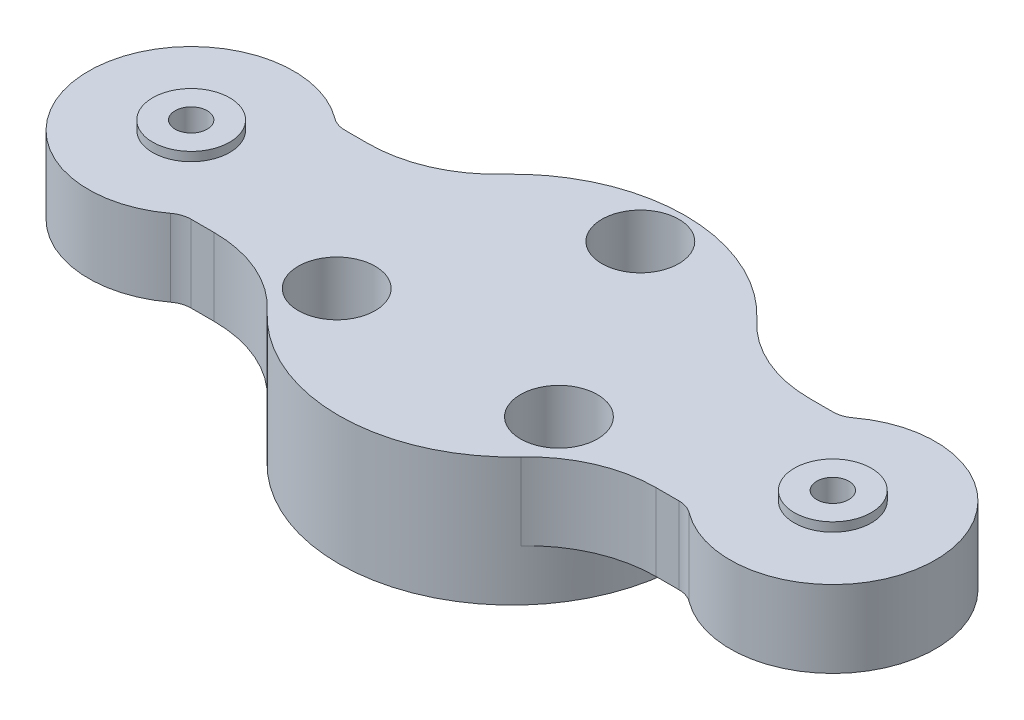
ISO-10303-21;
HEADER;
FILE_DESCRIPTION(('STEP AP214'),'2;1');
FILE_NAME('part.step','',(''),(''),'','','');
FILE_SCHEMA(('AUTOMOTIVE_DESIGN { 1 0 10303 214 1 1 1 1 }'));
ENDSEC;
DATA;
#1=APPLICATION_CONTEXT('core data for automotive mechanical design processes');
#2=APPLICATION_PROTOCOL_DEFINITION('international standard','automotive_design',2000,#1);
#3=PRODUCT_CONTEXT('',#1,'mechanical');
#4=PRODUCT('Part','Part','',(#3));
#5=PRODUCT_RELATED_PRODUCT_CATEGORY('part','',(#4));
#6=PRODUCT_DEFINITION_FORMATION('','',#4);
#7=PRODUCT_DEFINITION_CONTEXT('part definition',#1,'design');
#8=PRODUCT_DEFINITION('design','',#6,#7);
#9=PRODUCT_DEFINITION_SHAPE('','',#8);
#10=(LENGTH_UNIT() NAMED_UNIT(*) SI_UNIT(.MILLI.,.METRE.));
#11=(NAMED_UNIT(*) PLANE_ANGLE_UNIT() SI_UNIT($,.RADIAN.));
#12=(NAMED_UNIT(*) SI_UNIT($,.STERADIAN.) SOLID_ANGLE_UNIT());
#13=UNCERTAINTY_MEASURE_WITH_UNIT(LENGTH_MEASURE(1.E-05),#10,'distance_accuracy_value','');
#14=(GEOMETRIC_REPRESENTATION_CONTEXT(3) GLOBAL_UNCERTAINTY_ASSIGNED_CONTEXT((#13)) GLOBAL_UNIT_ASSIGNED_CONTEXT((#10,
#11,#12)) REPRESENTATION_CONTEXT('',''));
#15=CARTESIAN_POINT('',(0.,0.,0.));
#16=DIRECTION('',(0.,0.,1.));
#17=DIRECTION('',(1.,0.,0.));
#18=AXIS2_PLACEMENT_3D('',#15,#16,#17);
#19=CARTESIAN_POINT('',(0.,10.,0.));
#20=DIRECTION('',(0.,1.,0.));
#21=DIRECTION('',(0.,0.,1.));
#22=AXIS2_PLACEMENT_3D('',#19,#20,#21);
#23=PLANE('',#22);
#24=CARTESIAN_POINT('',(25.,10.,0.));
#25=DIRECTION('',(0.,1.,0.));
#26=DIRECTION('',(0.,0.,1.));
#27=AXIS2_PLACEMENT_3D('',#24,#25,#26);
#28=CIRCLE('',#27,3.);
#29=CARTESIAN_POINT('',(25.,10.,2.99999999999999));
#30=VERTEX_POINT('',#29);
#31=EDGE_CURVE('E228',#30,#30,#28,.T.);
#32=ORIENTED_EDGE('',*,*,#31,.F.);
#33=EDGE_LOOP('',(#32));
#34=FACE_BOUND('',#33,.T.);
#35=CARTESIAN_POINT('',(0.,10.,-10.));
#36=DIRECTION('',(0.,1.,0.));
#37=DIRECTION('',(0.,0.,1.));
#38=AXIS2_PLACEMENT_3D('',#35,#36,#37);
#39=CIRCLE('',#38,3.);
#40=CARTESIAN_POINT('',(0.,10.,-7.));
#41=VERTEX_POINT('',#40);
#42=EDGE_CURVE('E236',#41,#41,#39,.T.);
#43=ORIENTED_EDGE('',*,*,#42,.F.);
#44=EDGE_LOOP('',(#43));
#45=FACE_BOUND('',#44,.T.);
#46=CARTESIAN_POINT('',(8.66025403784502,10.,4.99999999999963));
#47=DIRECTION('',(0.,1.,0.));
#48=DIRECTION('',(0.,0.,1.));
#49=AXIS2_PLACEMENT_3D('',#46,#47,#48);
#50=CIRCLE('',#49,3.);
#51=CARTESIAN_POINT('',(8.66025403784502,10.,7.99999999999963));
#52=VERTEX_POINT('',#51);
#53=EDGE_CURVE('E240',#52,#52,#50,.T.);
#54=ORIENTED_EDGE('',*,*,#53,.F.);
#55=EDGE_LOOP('',(#54));
#56=FACE_BOUND('',#55,.T.);
#57=CARTESIAN_POINT('',(-8.66025403784375,10.,5.00000000000037));
#58=DIRECTION('',(0.,1.,0.));
#59=DIRECTION('',(0.,0.,1.));
#60=AXIS2_PLACEMENT_3D('',#57,#58,#59);
#61=CIRCLE('',#60,3.);
#62=CARTESIAN_POINT('',(-8.66025403784375,10.,8.00000000000037));
#63=VERTEX_POINT('',#62);
#64=EDGE_CURVE('E249',#63,#63,#61,.T.);
#65=ORIENTED_EDGE('',*,*,#64,.F.);
#66=EDGE_LOOP('',(#65));
#67=FACE_BOUND('',#66,.T.);
#68=CARTESIAN_POINT('',(-25.,10.,0.));
#69=DIRECTION('',(0.,1.,0.));
#70=DIRECTION('',(0.,0.,1.));
#71=AXIS2_PLACEMENT_3D('',#68,#69,#70);
#72=CIRCLE('',#71,8.);
#73=CARTESIAN_POINT('',(-20.2,10.,-6.4));
#74=VERTEX_POINT('',#73);
#75=CARTESIAN_POINT('',(-20.2,10.,6.4));
#76=VERTEX_POINT('',#75);
#77=EDGE_CURVE('E277',#74,#76,#72,.T.);
#78=ORIENTED_EDGE('',*,*,#77,.T.);
#79=CARTESIAN_POINT('',(-19.,10.,8.));
#80=DIRECTION('',(0.,1.,0.));
#81=DIRECTION('',(0.,0.,1.));
#82=AXIS2_PLACEMENT_3D('',#79,#80,#81);
#83=CIRCLE('',#82,2.);
#84=CARTESIAN_POINT('',(-19.,10.,6.));
#85=VERTEX_POINT('',#84);
#86=EDGE_CURVE('E63',#76,#85,#83,.F.);
#87=ORIENTED_EDGE('',*,*,#86,.T.);
#88=DIRECTION('',(1.,0.,0.));
#89=VECTOR('',#88,1.);
#90=CARTESIAN_POINT('',(0.,10.,6.));
#91=LINE('',#90,#89);
#92=CARTESIAN_POINT('',(-17.2119144780585,10.,6.));
#93=VERTEX_POINT('',#92);
#94=EDGE_CURVE('E263',#85,#93,#91,.T.);
#95=ORIENTED_EDGE('',*,*,#94,.T.);
#96=CARTESIAN_POINT('',(-17.2119144780585,10.,16.));
#97=DIRECTION('',(0.,1.,0.));
#98=DIRECTION('',(0.,0.,1.));
#99=AXIS2_PLACEMENT_3D('',#96,#97,#98);
#100=CIRCLE('',#99,10.);
#101=CARTESIAN_POINT('',(-9.8876955512251,10.,9.19148936170213));
#102=VERTEX_POINT('',#101);
#103=EDGE_CURVE('E390',#93,#102,#100,.F.);
#104=ORIENTED_EDGE('',*,*,#103,.T.);
#105=CARTESIAN_POINT('',(0.,10.,0.));
#106=DIRECTION('',(0.,1.,0.));
#107=DIRECTION('',(0.,0.,1.));
#108=AXIS2_PLACEMENT_3D('',#105,#106,#107);
#109=CIRCLE('',#108,13.5);
#110=CARTESIAN_POINT('',(9.8876955512251,10.,9.19148936170212));
#111=VERTEX_POINT('',#110);
#112=EDGE_CURVE('E318',#102,#111,#109,.T.);
#113=ORIENTED_EDGE('',*,*,#112,.T.);
#114=CARTESIAN_POINT('',(17.2119144780585,10.,16.));
#115=DIRECTION('',(0.,1.,0.));
#116=DIRECTION('',(0.,0.,1.));
#117=AXIS2_PLACEMENT_3D('',#114,#115,#116);
#118=CIRCLE('',#117,10.);
#119=CARTESIAN_POINT('',(17.2119144780585,10.,5.99999999999999));
#120=VERTEX_POINT('',#119);
#121=EDGE_CURVE('E367',#111,#120,#118,.F.);
#122=ORIENTED_EDGE('',*,*,#121,.T.);
#123=DIRECTION('',(-1.,0.,0.));
#124=VECTOR('',#123,1.);
#125=CARTESIAN_POINT('',(0.,10.,6.));
#126=LINE('',#125,#124);
#127=CARTESIAN_POINT('',(19.,10.,5.99999999999999));
#128=VERTEX_POINT('',#127);
#129=EDGE_CURVE('E288',#128,#120,#126,.T.);
#130=ORIENTED_EDGE('',*,*,#129,.F.);
#131=CARTESIAN_POINT('',(19.,10.,7.99999999999999));
#132=DIRECTION('',(0.,1.,0.));
#133=DIRECTION('',(0.,0.,1.));
#134=AXIS2_PLACEMENT_3D('',#131,#132,#133);
#135=CIRCLE('',#134,2.);
#136=CARTESIAN_POINT('',(20.2,10.,6.39999999999999));
#137=VERTEX_POINT('',#136);
#138=EDGE_CURVE('E430',#128,#137,#135,.F.);
#139=ORIENTED_EDGE('',*,*,#138,.T.);
#140=CARTESIAN_POINT('',(25.,10.,0.));
#141=DIRECTION('',(0.,1.,0.));
#142=DIRECTION('',(0.,0.,1.));
#143=AXIS2_PLACEMENT_3D('',#140,#141,#142);
#144=CIRCLE('',#143,8.);
#145=CARTESIAN_POINT('',(20.2,10.,-6.4));
#146=VERTEX_POINT('',#145);
#147=EDGE_CURVE('E296',#146,#137,#144,.F.);
#148=ORIENTED_EDGE('',*,*,#147,.F.);
#149=CARTESIAN_POINT('',(19.,10.,-8.));
#150=DIRECTION('',(0.,1.,0.));
#151=DIRECTION('',(0.,0.,1.));
#152=AXIS2_PLACEMENT_3D('',#149,#150,#151);
#153=CIRCLE('',#152,2.);
#154=CARTESIAN_POINT('',(19.,10.,-6.));
#155=VERTEX_POINT('',#154);
#156=EDGE_CURVE('E424',#146,#155,#153,.F.);
#157=ORIENTED_EDGE('',*,*,#156,.T.);
#158=DIRECTION('',(-1.,0.,0.));
#159=VECTOR('',#158,1.);
#160=CARTESIAN_POINT('',(0.,10.,-6.));
#161=LINE('',#160,#159);
#162=CARTESIAN_POINT('',(17.2119144780585,10.,-6.));
#163=VERTEX_POINT('',#162);
#164=EDGE_CURVE('E300',#155,#163,#161,.T.);
#165=ORIENTED_EDGE('',*,*,#164,.T.);
#166=CARTESIAN_POINT('',(17.2119144780585,10.,-16.));
#167=DIRECTION('',(0.,1.,0.));
#168=DIRECTION('',(0.,0.,1.));
#169=AXIS2_PLACEMENT_3D('',#166,#167,#168);
#170=CIRCLE('',#169,10.);
#171=CARTESIAN_POINT('',(9.8876955512251,10.,-9.19148936170213));
#172=VERTEX_POINT('',#171);
#173=EDGE_CURVE('E375',#163,#172,#170,.F.);
#174=ORIENTED_EDGE('',*,*,#173,.T.);
#175=CARTESIAN_POINT('',(-9.8876955512251,10.,-9.19148936170213));
#176=VERTEX_POINT('',#175);
#177=EDGE_CURVE('E322',#172,#176,#109,.T.);
#178=ORIENTED_EDGE('',*,*,#177,.T.);
#179=CARTESIAN_POINT('',(-17.2119144780585,10.,-16.));
#180=DIRECTION('',(0.,1.,0.));
#181=DIRECTION('',(0.,0.,1.));
#182=AXIS2_PLACEMENT_3D('',#179,#180,#181);
#183=CIRCLE('',#182,10.);
#184=CARTESIAN_POINT('',(-17.2119144780585,10.,-6.));
#185=VERTEX_POINT('',#184);
#186=EDGE_CURVE('E382',#176,#185,#183,.F.);
#187=ORIENTED_EDGE('',*,*,#186,.T.);
#188=DIRECTION('',(1.,0.,0.));
#189=VECTOR('',#188,1.);
#190=CARTESIAN_POINT('',(0.,10.,-6.));
#191=LINE('',#190,#189);
#192=CARTESIAN_POINT('',(-19.,10.,-6.));
#193=VERTEX_POINT('',#192);
#194=EDGE_CURVE('E274',#193,#185,#191,.T.);
#195=ORIENTED_EDGE('',*,*,#194,.F.);
#196=CARTESIAN_POINT('',(-19.,10.,-8.));
#197=DIRECTION('',(0.,1.,0.));
#198=DIRECTION('',(0.,0.,1.));
#199=AXIS2_PLACEMENT_3D('',#196,#197,#198);
#200=CIRCLE('',#199,2.);
#201=EDGE_CURVE('E436',#193,#74,#200,.F.);
#202=ORIENTED_EDGE('',*,*,#201,.T.);
#203=EDGE_LOOP('',(#78,#87,#95,#104,#113,#122,#130,#139,#148,#157,#165,#174,#178,#187,#195,#202));
#204=FACE_BOUND('',#203,.T.);
#205=CARTESIAN_POINT('',(-25.,10.,0.));
#206=DIRECTION('',(0.,1.,0.));
#207=DIRECTION('',(0.,0.,1.));
#208=AXIS2_PLACEMENT_3D('',#205,#206,#207);
#209=CIRCLE('',#208,3.);
#210=CARTESIAN_POINT('',(-25.,10.,3.));
#211=VERTEX_POINT('',#210);
#212=EDGE_CURVE('E224',#211,#211,#209,.T.);
#213=ORIENTED_EDGE('',*,*,#212,.F.);
#214=EDGE_LOOP('',(#213));
#215=FACE_BOUND('',#214,.T.);
#216=ADVANCED_FACE('F53',(#34,#45,#56,#67,#204,#215),#23,.T.);
#217=CARTESIAN_POINT('',(0.,10.,-10.));
#218=DIRECTION('',(0.,-1.,0.));
#219=DIRECTION('',(0.,0.,-1.));
#220=AXIS2_PLACEMENT_3D('',#217,#218,#219);
#221=CYLINDRICAL_SURFACE('',#220,1.6);
#222=CARTESIAN_POINT('',(0.,0.,-10.));
#223=DIRECTION('',(0.,1.,0.));
#224=DIRECTION('',(0.,0.,1.));
#225=AXIS2_PLACEMENT_3D('',#222,#223,#224);
#226=CIRCLE('',#225,1.6);
#227=CARTESIAN_POINT('',(0.,0.,-8.4));
#228=VERTEX_POINT('',#227);
#229=EDGE_CURVE('E313',#228,#228,#226,.T.);
#230=ORIENTED_EDGE('',*,*,#229,.F.);
#231=EDGE_LOOP('',(#230));
#232=FACE_BOUND('',#231,.T.);
#233=CARTESIAN_POINT('',(0.,5.,-10.));
#234=DIRECTION('',(0.,1.,0.));
#235=DIRECTION('',(0.,0.,1.));
#236=AXIS2_PLACEMENT_3D('',#233,#234,#235);
#237=CIRCLE('',#236,1.6);
#238=CARTESIAN_POINT('',(0.,5.,-8.4));
#239=VERTEX_POINT('',#238);
#240=EDGE_CURVE('E301',#239,#239,#237,.T.);
#241=ORIENTED_EDGE('',*,*,#240,.T.);
#242=EDGE_LOOP('',(#241));
#243=FACE_BOUND('',#242,.T.);
#244=ADVANCED_FACE('F466',(#232,#243),#221,.F.);
#245=CARTESIAN_POINT('',(8.66025403784502,10.,4.99999999999963));
#246=DIRECTION('',(0.,-1.,0.));
#247=DIRECTION('',(0.,0.,-1.));
#248=AXIS2_PLACEMENT_3D('',#245,#246,#247);
#249=CYLINDRICAL_SURFACE('',#248,1.60000000000055);
#250=CARTESIAN_POINT('',(8.66025403784502,0.,4.99999999999963));
#251=DIRECTION('',(0.,1.,0.));
#252=DIRECTION('',(0.,0.,1.));
#253=AXIS2_PLACEMENT_3D('',#250,#251,#252);
#254=CIRCLE('',#253,1.60000000000055);
#255=CARTESIAN_POINT('',(8.66025403784502,0.,6.60000000000018));
#256=VERTEX_POINT('',#255);
#257=EDGE_CURVE('E309',#256,#256,#254,.T.);
#258=ORIENTED_EDGE('',*,*,#257,.F.);
#259=EDGE_LOOP('',(#258));
#260=FACE_BOUND('',#259,.T.);
#261=CARTESIAN_POINT('',(8.66025403784502,5.,4.99999999999963));
#262=DIRECTION('',(0.,1.,0.));
#263=DIRECTION('',(0.,0.,1.));
#264=AXIS2_PLACEMENT_3D('',#261,#262,#263);
#265=CIRCLE('',#264,1.60000000000055);
#266=CARTESIAN_POINT('',(8.66025403784502,5.,6.60000000000018));
#267=VERTEX_POINT('',#266);
#268=EDGE_CURVE('E329',#267,#267,#265,.T.);
#269=ORIENTED_EDGE('',*,*,#268,.T.);
#270=EDGE_LOOP('',(#269));
#271=FACE_BOUND('',#270,.T.);
#272=ADVANCED_FACE('F471',(#260,#271),#249,.F.);
#273=CARTESIAN_POINT('',(-8.66025403784375,10.,5.00000000000037));
#274=DIRECTION('',(0.,-1.,0.));
#275=DIRECTION('',(0.,0.,-1.));
#276=AXIS2_PLACEMENT_3D('',#273,#274,#275);
#277=CYLINDRICAL_SURFACE('',#276,1.6000000000008);
#278=CARTESIAN_POINT('',(-8.66025403784375,0.,5.00000000000037));
#279=DIRECTION('',(0.,1.,0.));
#280=DIRECTION('',(0.,0.,1.));
#281=AXIS2_PLACEMENT_3D('',#278,#279,#280);
#282=CIRCLE('',#281,1.6000000000008);
#283=CARTESIAN_POINT('',(-8.66025403784375,0.,6.60000000000117));
#284=VERTEX_POINT('',#283);
#285=EDGE_CURVE('E273',#284,#284,#282,.T.);
#286=ORIENTED_EDGE('',*,*,#285,.F.);
#287=EDGE_LOOP('',(#286));
#288=FACE_BOUND('',#287,.T.);
#289=CARTESIAN_POINT('',(-8.66025403784375,5.,5.00000000000037));
#290=DIRECTION('',(0.,1.,0.));
#291=DIRECTION('',(0.,0.,1.));
#292=AXIS2_PLACEMENT_3D('',#289,#290,#291);
#293=CIRCLE('',#292,1.6000000000008);
#294=CARTESIAN_POINT('',(-8.66025403784375,5.,6.60000000000117));
#295=VERTEX_POINT('',#294);
#296=EDGE_CURVE('E244',#295,#295,#293,.T.);
#297=ORIENTED_EDGE('',*,*,#296,.T.);
#298=EDGE_LOOP('',(#297));
#299=FACE_BOUND('',#298,.T.);
#300=ADVANCED_FACE('F486',(#288,#299),#277,.F.);
#301=CARTESIAN_POINT('',(0.,10.,0.));
#302=DIRECTION('',(0.,-1.,0.));
#303=DIRECTION('',(0.,0.,-1.));
#304=AXIS2_PLACEMENT_3D('',#301,#302,#303);
#305=CYLINDRICAL_SURFACE('',#304,13.5);
#306=CARTESIAN_POINT('',(0.,0.,0.));
#307=DIRECTION('',(0.,1.,0.));
#308=DIRECTION('',(0.,0.,1.));
#309=AXIS2_PLACEMENT_3D('',#306,#307,#308);
#310=CIRCLE('',#309,13.5);
#311=CARTESIAN_POINT('',(0.,0.,13.5));
#312=VERTEX_POINT('',#311);
#313=EDGE_CURVE('E317',#312,#312,#310,.T.);
#314=ORIENTED_EDGE('',*,*,#313,.T.);
#315=EDGE_LOOP('',(#314));
#316=FACE_BOUND('',#315,.T.);
#317=CARTESIAN_POINT('',(0.,4.,0.));
#318=DIRECTION('',(0.,1.,0.));
#319=DIRECTION('',(0.,0.,1.));
#320=AXIS2_PLACEMENT_3D('',#317,#318,#319);
#321=CIRCLE('',#320,13.5);
#322=CARTESIAN_POINT('',(9.8876955512251,4.,9.19148936170212));
#323=VERTEX_POINT('',#322);
#324=CARTESIAN_POINT('',(9.8876955512251,4.,-9.19148936170213));
#325=VERTEX_POINT('',#324);
#326=EDGE_CURVE('E291',#323,#325,#321,.T.);
#327=ORIENTED_EDGE('',*,*,#326,.F.);
#328=DIRECTION('',(0.,-1.,0.));
#329=VECTOR('',#328,1.);
#330=CARTESIAN_POINT('',(9.8876955512251,10.,9.19148936170212));
#331=LINE('',#330,#329);
#332=EDGE_CURVE('E347',#323,#111,#331,.F.);
#333=ORIENTED_EDGE('',*,*,#332,.T.);
#334=ORIENTED_EDGE('',*,*,#112,.F.);
#335=DIRECTION('',(0.,-1.,0.));
#336=VECTOR('',#335,1.);
#337=CARTESIAN_POINT('',(-9.8876955512251,10.,9.19148936170213));
#338=LINE('',#337,#336);
#339=CARTESIAN_POINT('',(-9.8876955512251,4.,9.19148936170213));
#340=VERTEX_POINT('',#339);
#341=EDGE_CURVE('E336',#102,#340,#338,.T.);
#342=ORIENTED_EDGE('',*,*,#341,.T.);
#343=CARTESIAN_POINT('',(0.,4.,0.));
#344=DIRECTION('',(0.,1.,0.));
#345=DIRECTION('',(0.,0.,1.));
#346=AXIS2_PLACEMENT_3D('',#343,#344,#345);
#347=CIRCLE('',#346,13.5);
#348=CARTESIAN_POINT('',(-9.8876955512251,4.,-9.19148936170213));
#349=VERTEX_POINT('',#348);
#350=EDGE_CURVE('E270',#349,#340,#347,.T.);
#351=ORIENTED_EDGE('',*,*,#350,.F.);
#352=DIRECTION('',(0.,-1.,0.));
#353=VECTOR('',#352,1.);
#354=CARTESIAN_POINT('',(-9.8876955512251,10.,-9.19148936170213));
#355=LINE('',#354,#353);
#356=EDGE_CURVE('E340',#349,#176,#355,.F.);
#357=ORIENTED_EDGE('',*,*,#356,.T.);
#358=ORIENTED_EDGE('',*,*,#177,.F.);
#359=DIRECTION('',(0.,-1.,0.));
#360=VECTOR('',#359,1.);
#361=CARTESIAN_POINT('',(9.8876955512251,10.,-9.19148936170213));
#362=LINE('',#361,#360);
#363=EDGE_CURVE('E344',#172,#325,#362,.T.);
#364=ORIENTED_EDGE('',*,*,#363,.T.);
#365=EDGE_LOOP('',(#327,#333,#334,#342,#351,#357,#358,#364));
#366=FACE_BOUND('',#365,.T.);
#367=ADVANCED_FACE('F482',(#316,#366),#305,.T.);
#368=CARTESIAN_POINT('',(0.,0.,0.));
#369=DIRECTION('',(0.,1.,0.));
#370=DIRECTION('',(0.,0.,1.));
#371=AXIS2_PLACEMENT_3D('',#368,#369,#370);
#372=PLANE('',#371);
#373=CARTESIAN_POINT('',(5.84532422465145E-13,0.,10.));
#374=DIRECTION('',(0.,-1.,0.));
#375=DIRECTION('',(0.,0.,-1.));
#376=AXIS2_PLACEMENT_3D('',#373,#374,#375);
#377=CIRCLE('',#376,0.999999999999989);
#378=CARTESIAN_POINT('',(5.84532422465145E-13,0.,9.00000000000001));
#379=VERTEX_POINT('',#378);
#380=EDGE_CURVE('E186',#379,#379,#377,.T.);
#381=ORIENTED_EDGE('',*,*,#380,.F.);
#382=EDGE_LOOP('',(#381));
#383=FACE_BOUND('',#382,.T.);
#384=CARTESIAN_POINT('',(8.66025403784407,0.,-5.0000000000005));
#385=DIRECTION('',(0.,-1.,0.));
#386=DIRECTION('',(0.,0.,-1.));
#387=AXIS2_PLACEMENT_3D('',#384,#385,#386);
#388=CIRCLE('',#387,0.999999999999989);
#389=CARTESIAN_POINT('',(8.66025403784407,0.,-6.00000000000049));
#390=VERTEX_POINT('',#389);
#391=EDGE_CURVE('E185',#390,#390,#388,.T.);
#392=ORIENTED_EDGE('',*,*,#391,.F.);
#393=EDGE_LOOP('',(#392));
#394=FACE_BOUND('',#393,.T.);
#395=CARTESIAN_POINT('',(-8.66025403784469,0.,-4.99999999999947));
#396=DIRECTION('',(0.,-1.,0.));
#397=DIRECTION('',(0.,0.,-1.));
#398=AXIS2_PLACEMENT_3D('',#395,#396,#397);
#399=CIRCLE('',#398,0.999999999999989);
#400=CARTESIAN_POINT('',(-8.66025403784469,0.,-5.99999999999946));
#401=VERTEX_POINT('',#400);
#402=EDGE_CURVE('E202',#401,#401,#399,.T.);
#403=ORIENTED_EDGE('',*,*,#402,.F.);
#404=EDGE_LOOP('',(#403));
#405=FACE_BOUND('',#404,.T.);
#406=ORIENTED_EDGE('',*,*,#313,.F.);
#407=EDGE_LOOP('',(#406));
#408=FACE_BOUND('',#407,.T.);
#409=ORIENTED_EDGE('',*,*,#229,.T.);
#410=EDGE_LOOP('',(#409));
#411=FACE_BOUND('',#410,.T.);
#412=ORIENTED_EDGE('',*,*,#257,.T.);
#413=EDGE_LOOP('',(#412));
#414=FACE_BOUND('',#413,.T.);
#415=ORIENTED_EDGE('',*,*,#285,.T.);
#416=EDGE_LOOP('',(#415));
#417=FACE_BOUND('',#416,.T.);
#418=ADVANCED_FACE('F478',(#383,#394,#405,#408,#411,#414,#417),#372,.F.);
#419=CARTESIAN_POINT('',(25.,4.,0.));
#420=DIRECTION('',(0.,1.,0.));
#421=DIRECTION('',(0.,0.,1.));
#422=AXIS2_PLACEMENT_3D('',#419,#420,#421);
#423=CYLINDRICAL_SURFACE('',#422,8.);
#424=CARTESIAN_POINT('',(25.,4.,0.));
#425=DIRECTION('',(0.,1.,0.));
#426=DIRECTION('',(0.,0.,1.));
#427=AXIS2_PLACEMENT_3D('',#424,#425,#426);
#428=CIRCLE('',#427,8.);
#429=CARTESIAN_POINT('',(20.2,4.,-6.4));
#430=VERTEX_POINT('',#429);
#431=CARTESIAN_POINT('',(20.2,4.,6.39999999999999));
#432=VERTEX_POINT('',#431);
#433=EDGE_CURVE('E283',#430,#432,#428,.F.);
#434=ORIENTED_EDGE('',*,*,#433,.F.);
#435=DIRECTION('',(0.,1.,0.));
#436=VECTOR('',#435,1.);
#437=CARTESIAN_POINT('',(20.2,4.,-6.4));
#438=LINE('',#437,#436);
#439=EDGE_CURVE('E400',#430,#146,#438,.T.);
#440=ORIENTED_EDGE('',*,*,#439,.T.);
#441=ORIENTED_EDGE('',*,*,#147,.T.);
#442=DIRECTION('',(0.,1.,0.));
#443=VECTOR('',#442,1.);
#444=CARTESIAN_POINT('',(20.2,4.,6.39999999999999));
#445=LINE('',#444,#443);
#446=EDGE_CURVE('E397',#137,#432,#445,.F.);
#447=ORIENTED_EDGE('',*,*,#446,.T.);
#448=EDGE_LOOP('',(#434,#440,#441,#447));
#449=FACE_BOUND('',#448,.T.);
#450=ADVANCED_FACE('F481',(#449),#423,.T.);
#451=CARTESIAN_POINT('',(0.,4.,6.));
#452=DIRECTION('',(0.,0.,-1.));
#453=DIRECTION('',(-1.,0.,0.));
#454=AXIS2_PLACEMENT_3D('',#451,#452,#453);
#455=PLANE('',#454);
#456=DIRECTION('',(-1.,0.,0.));
#457=VECTOR('',#456,1.);
#458=CARTESIAN_POINT('',(0.,4.,6.));
#459=LINE('',#458,#457);
#460=CARTESIAN_POINT('',(19.,4.,5.99999999999999));
#461=VERTEX_POINT('',#460);
#462=CARTESIAN_POINT('',(17.2119144780585,4.,5.99999999999999));
#463=VERTEX_POINT('',#462);
#464=EDGE_CURVE('E278',#461,#463,#459,.T.);
#465=ORIENTED_EDGE('',*,*,#464,.F.);
#466=DIRECTION('',(0.,-1.,0.));
#467=VECTOR('',#466,1.);
#468=CARTESIAN_POINT('',(19.,10.,5.99999999999999));
#469=LINE('',#468,#467);
#470=EDGE_CURVE('E407',#461,#128,#469,.F.);
#471=ORIENTED_EDGE('',*,*,#470,.T.);
#472=ORIENTED_EDGE('',*,*,#129,.T.);
#473=DIRECTION('',(0.,1.,0.));
#474=VECTOR('',#473,1.);
#475=CARTESIAN_POINT('',(17.2119144780585,4.,5.99999999999999));
#476=LINE('',#475,#474);
#477=EDGE_CURVE('E351',#120,#463,#476,.F.);
#478=ORIENTED_EDGE('',*,*,#477,.T.);
#479=EDGE_LOOP('',(#465,#471,#472,#478));
#480=FACE_BOUND('',#479,.T.);
#481=ADVANCED_FACE('F556',(#480),#455,.F.);
#482=CARTESIAN_POINT('',(0.,4.,-6.));
#483=DIRECTION('',(0.,0.,-1.));
#484=DIRECTION('',(-1.,0.,0.));
#485=AXIS2_PLACEMENT_3D('',#482,#483,#484);
#486=PLANE('',#485);
#487=ORIENTED_EDGE('',*,*,#164,.F.);
#488=DIRECTION('',(0.,1.,0.));
#489=VECTOR('',#488,1.);
#490=CARTESIAN_POINT('',(19.,4.,-6.));
#491=LINE('',#490,#489);
#492=CARTESIAN_POINT('',(19.,4.,-6.));
#493=VERTEX_POINT('',#492);
#494=EDGE_CURVE('E404',#155,#493,#491,.F.);
#495=ORIENTED_EDGE('',*,*,#494,.T.);
#496=DIRECTION('',(-1.,0.,0.));
#497=VECTOR('',#496,1.);
#498=CARTESIAN_POINT('',(0.,4.,-6.));
#499=LINE('',#498,#497);
#500=CARTESIAN_POINT('',(17.2119144780585,4.,-6.));
#501=VERTEX_POINT('',#500);
#502=EDGE_CURVE('E287',#493,#501,#499,.T.);
#503=ORIENTED_EDGE('',*,*,#502,.T.);
#504=DIRECTION('',(0.,-1.,0.));
#505=VECTOR('',#504,1.);
#506=CARTESIAN_POINT('',(17.2119144780585,4.,-6.));
#507=LINE('',#506,#505);
#508=EDGE_CURVE('E355',#501,#163,#507,.F.);
#509=ORIENTED_EDGE('',*,*,#508,.T.);
#510=EDGE_LOOP('',(#487,#495,#503,#509));
#511=FACE_BOUND('',#510,.T.);
#512=ADVANCED_FACE('F567',(#511),#486,.T.);
#513=CARTESIAN_POINT('',(0.,4.,0.));
#514=DIRECTION('',(0.,1.,0.));
#515=DIRECTION('',(0.,0.,1.));
#516=AXIS2_PLACEMENT_3D('',#513,#514,#515);
#517=PLANE('',#516);
#518=CARTESIAN_POINT('',(25.,4.,0.));
#519=DIRECTION('',(0.,1.,0.));
#520=DIRECTION('',(0.,0.,1.));
#521=AXIS2_PLACEMENT_3D('',#518,#519,#520);
#522=CIRCLE('',#521,1.25);
#523=CARTESIAN_POINT('',(25.,4.,1.24999999999999));
#524=VERTEX_POINT('',#523);
#525=EDGE_CURVE('E218',#524,#524,#522,.T.);
#526=ORIENTED_EDGE('',*,*,#525,.T.);
#527=EDGE_LOOP('',(#526));
#528=FACE_BOUND('',#527,.T.);
#529=ORIENTED_EDGE('',*,*,#502,.F.);
#530=CARTESIAN_POINT('',(19.,4.,-8.));
#531=DIRECTION('',(0.,1.,0.));
#532=DIRECTION('',(0.,0.,1.));
#533=AXIS2_PLACEMENT_3D('',#530,#531,#532);
#534=CIRCLE('',#533,2.);
#535=EDGE_CURVE('E427',#493,#430,#534,.T.);
#536=ORIENTED_EDGE('',*,*,#535,.T.);
#537=ORIENTED_EDGE('',*,*,#433,.T.);
#538=CARTESIAN_POINT('',(19.,4.,7.99999999999999));
#539=DIRECTION('',(0.,1.,0.));
#540=DIRECTION('',(0.,0.,1.));
#541=AXIS2_PLACEMENT_3D('',#538,#539,#540);
#542=CIRCLE('',#541,2.);
#543=EDGE_CURVE('E433',#432,#461,#542,.T.);
#544=ORIENTED_EDGE('',*,*,#543,.T.);
#545=ORIENTED_EDGE('',*,*,#464,.T.);
#546=CARTESIAN_POINT('',(17.2119144780585,4.,16.));
#547=DIRECTION('',(0.,1.,0.));
#548=DIRECTION('',(0.,0.,1.));
#549=AXIS2_PLACEMENT_3D('',#546,#547,#548);
#550=CIRCLE('',#549,10.);
#551=EDGE_CURVE('E371',#463,#323,#550,.T.);
#552=ORIENTED_EDGE('',*,*,#551,.T.);
#553=ORIENTED_EDGE('',*,*,#326,.T.);
#554=CARTESIAN_POINT('',(17.2119144780585,4.,-16.));
#555=DIRECTION('',(0.,1.,0.));
#556=DIRECTION('',(0.,0.,1.));
#557=AXIS2_PLACEMENT_3D('',#554,#555,#556);
#558=CIRCLE('',#557,10.);
#559=EDGE_CURVE('E378',#325,#501,#558,.T.);
#560=ORIENTED_EDGE('',*,*,#559,.T.);
#561=EDGE_LOOP('',(#529,#536,#537,#544,#545,#552,#553,#560));
#562=FACE_BOUND('',#561,.T.);
#563=ADVANCED_FACE('F448',(#528,#562),#517,.F.);
#564=CARTESIAN_POINT('',(0.,4.,-6.));
#565=DIRECTION('',(0.,0.,1.));
#566=DIRECTION('',(1.,0.,0.));
#567=AXIS2_PLACEMENT_3D('',#564,#565,#566);
#568=PLANE('',#567);
#569=DIRECTION('',(1.,0.,0.));
#570=VECTOR('',#569,1.);
#571=CARTESIAN_POINT('',(0.,4.,-6.));
#572=LINE('',#571,#570);
#573=CARTESIAN_POINT('',(-19.,4.,-6.));
#574=VERTEX_POINT('',#573);
#575=CARTESIAN_POINT('',(-17.2119144780585,4.,-6.));
#576=VERTEX_POINT('',#575);
#577=EDGE_CURVE('E259',#574,#576,#572,.T.);
#578=ORIENTED_EDGE('',*,*,#577,.F.);
#579=DIRECTION('',(0.,1.,0.));
#580=VECTOR('',#579,1.);
#581=CARTESIAN_POINT('',(-19.,4.,-6.));
#582=LINE('',#581,#580);
#583=EDGE_CURVE('E411',#574,#193,#582,.T.);
#584=ORIENTED_EDGE('',*,*,#583,.T.);
#585=ORIENTED_EDGE('',*,*,#194,.T.);
#586=DIRECTION('',(0.,1.,0.));
#587=VECTOR('',#586,1.);
#588=CARTESIAN_POINT('',(-17.2119144780585,4.,-6.));
#589=LINE('',#588,#587);
#590=EDGE_CURVE('E359',#185,#576,#589,.F.);
#591=ORIENTED_EDGE('',*,*,#590,.T.);
#592=EDGE_LOOP('',(#578,#584,#585,#591));
#593=FACE_BOUND('',#592,.T.);
#594=ADVANCED_FACE('F523',(#593),#568,.F.);
#595=CARTESIAN_POINT('',(0.,4.,6.));
#596=DIRECTION('',(0.,0.,1.));
#597=DIRECTION('',(1.,0.,0.));
#598=AXIS2_PLACEMENT_3D('',#595,#596,#597);
#599=PLANE('',#598);
#600=ORIENTED_EDGE('',*,*,#94,.F.);
#601=DIRECTION('',(0.,-1.,0.));
#602=VECTOR('',#601,1.);
#603=CARTESIAN_POINT('',(-19.,4.,6.));
#604=LINE('',#603,#602);
#605=CARTESIAN_POINT('',(-19.,4.,6.));
#606=VERTEX_POINT('',#605);
#607=EDGE_CURVE('E77',#85,#606,#604,.T.);
#608=ORIENTED_EDGE('',*,*,#607,.T.);
#609=DIRECTION('',(1.,0.,0.));
#610=VECTOR('',#609,1.);
#611=CARTESIAN_POINT('',(0.,4.,6.));
#612=LINE('',#611,#610);
#613=CARTESIAN_POINT('',(-17.2119144780585,4.,6.));
#614=VERTEX_POINT('',#613);
#615=EDGE_CURVE('E267',#606,#614,#612,.T.);
#616=ORIENTED_EDGE('',*,*,#615,.T.);
#617=DIRECTION('',(0.,-1.,0.));
#618=VECTOR('',#617,1.);
#619=CARTESIAN_POINT('',(-17.2119144780585,4.,6.));
#620=LINE('',#619,#618);
#621=EDGE_CURVE('E363',#614,#93,#620,.F.);
#622=ORIENTED_EDGE('',*,*,#621,.T.);
#623=EDGE_LOOP('',(#600,#608,#616,#622));
#624=FACE_BOUND('',#623,.T.);
#625=ADVANCED_FACE('F534',(#624),#599,.T.);
#626=CARTESIAN_POINT('',(-25.,4.,0.));
#627=DIRECTION('',(0.,1.,0.));
#628=DIRECTION('',(0.,0.,1.));
#629=AXIS2_PLACEMENT_3D('',#626,#627,#628);
#630=CYLINDRICAL_SURFACE('',#629,8.);
#631=ORIENTED_EDGE('',*,*,#77,.F.);
#632=DIRECTION('',(0.,1.,0.));
#633=VECTOR('',#632,1.);
#634=CARTESIAN_POINT('',(-20.2,4.,-6.4));
#635=LINE('',#634,#633);
#636=CARTESIAN_POINT('',(-20.2,4.,-6.4));
#637=VERTEX_POINT('',#636);
#638=EDGE_CURVE('E419',#74,#637,#635,.F.);
#639=ORIENTED_EDGE('',*,*,#638,.T.);
#640=CARTESIAN_POINT('',(-25.,4.,0.));
#641=DIRECTION('',(0.,1.,0.));
#642=DIRECTION('',(0.,0.,1.));
#643=AXIS2_PLACEMENT_3D('',#640,#641,#642);
#644=CIRCLE('',#643,8.);
#645=CARTESIAN_POINT('',(-20.2,4.,6.4));
#646=VERTEX_POINT('',#645);
#647=EDGE_CURVE('E262',#637,#646,#644,.T.);
#648=ORIENTED_EDGE('',*,*,#647,.T.);
#649=DIRECTION('',(0.,1.,0.));
#650=VECTOR('',#649,1.);
#651=CARTESIAN_POINT('',(-20.2,4.,6.4));
#652=LINE('',#651,#650);
#653=EDGE_CURVE('E415',#646,#76,#652,.T.);
#654=ORIENTED_EDGE('',*,*,#653,.T.);
#655=EDGE_LOOP('',(#631,#639,#648,#654));
#656=FACE_BOUND('',#655,.T.);
#657=ADVANCED_FACE('F539',(#656),#630,.T.);
#658=CARTESIAN_POINT('',(0.,4.,0.));
#659=DIRECTION('',(0.,1.,0.));
#660=DIRECTION('',(0.,0.,1.));
#661=AXIS2_PLACEMENT_3D('',#658,#659,#660);
#662=PLANE('',#661);
#663=CARTESIAN_POINT('',(-25.,4.,0.));
#664=DIRECTION('',(0.,1.,0.));
#665=DIRECTION('',(0.,0.,1.));
#666=AXIS2_PLACEMENT_3D('',#663,#664,#665);
#667=CIRCLE('',#666,1.25);
#668=CARTESIAN_POINT('',(-25.,4.,1.25));
#669=VERTEX_POINT('',#668);
#670=EDGE_CURVE('E57',#669,#669,#667,.T.);
#671=ORIENTED_EDGE('',*,*,#670,.T.);
#672=EDGE_LOOP('',(#671));
#673=FACE_BOUND('',#672,.T.);
#674=ORIENTED_EDGE('',*,*,#647,.F.);
#675=CARTESIAN_POINT('',(-19.,4.,-8.));
#676=DIRECTION('',(0.,1.,0.));
#677=DIRECTION('',(0.,0.,1.));
#678=AXIS2_PLACEMENT_3D('',#675,#676,#677);
#679=CIRCLE('',#678,2.);
#680=EDGE_CURVE('E439',#637,#574,#679,.T.);
#681=ORIENTED_EDGE('',*,*,#680,.T.);
#682=ORIENTED_EDGE('',*,*,#577,.T.);
#683=CARTESIAN_POINT('',(-17.2119144780585,4.,-16.));
#684=DIRECTION('',(0.,1.,0.));
#685=DIRECTION('',(0.,0.,1.));
#686=AXIS2_PLACEMENT_3D('',#683,#684,#685);
#687=CIRCLE('',#686,10.);
#688=EDGE_CURVE('E386',#576,#349,#687,.T.);
#689=ORIENTED_EDGE('',*,*,#688,.T.);
#690=ORIENTED_EDGE('',*,*,#350,.T.);
#691=CARTESIAN_POINT('',(-17.2119144780585,4.,16.));
#692=DIRECTION('',(0.,1.,0.));
#693=DIRECTION('',(0.,0.,1.));
#694=AXIS2_PLACEMENT_3D('',#691,#692,#693);
#695=CIRCLE('',#694,10.);
#696=EDGE_CURVE('E393',#340,#614,#695,.T.);
#697=ORIENTED_EDGE('',*,*,#696,.T.);
#698=ORIENTED_EDGE('',*,*,#615,.F.);
#699=CARTESIAN_POINT('',(-19.,4.,8.));
#700=DIRECTION('',(0.,1.,0.));
#701=DIRECTION('',(0.,0.,1.));
#702=AXIS2_PLACEMENT_3D('',#699,#700,#701);
#703=CIRCLE('',#702,2.);
#704=EDGE_CURVE('E12',#606,#646,#703,.T.);
#705=ORIENTED_EDGE('',*,*,#704,.T.);
#706=EDGE_LOOP('',(#674,#681,#682,#689,#690,#697,#698,#705));
#707=FACE_BOUND('',#706,.T.);
#708=ADVANCED_FACE('F521',(#673,#707),#662,.F.);
#709=CARTESIAN_POINT('',(-8.66025403784375,-8.48528137423857,5.00000000000037));
#710=DIRECTION('',(0.,1.,0.));
#711=DIRECTION('',(0.,0.,1.));
#712=AXIS2_PLACEMENT_3D('',#709,#710,#711);
#713=CYLINDRICAL_SURFACE('',#712,3.);
#714=CARTESIAN_POINT('',(-8.66025403784375,5.,5.00000000000037));
#715=DIRECTION('',(0.,1.,0.));
#716=DIRECTION('',(0.,0.,1.));
#717=AXIS2_PLACEMENT_3D('',#714,#715,#716);
#718=CIRCLE('',#717,3.);
#719=CARTESIAN_POINT('',(-8.66025403784375,5.,8.00000000000037));
#720=VERTEX_POINT('',#719);
#721=EDGE_CURVE('E223',#720,#720,#718,.F.);
#722=ORIENTED_EDGE('',*,*,#721,.T.);
#723=EDGE_LOOP('',(#722));
#724=FACE_BOUND('',#723,.T.);
#725=ORIENTED_EDGE('',*,*,#64,.T.);
#726=EDGE_LOOP('',(#725));
#727=FACE_BOUND('',#726,.T.);
#728=ADVANCED_FACE('F604',(#724,#727),#713,.F.);
#729=CARTESIAN_POINT('',(0.,5.,0.));
#730=DIRECTION('',(0.,1.,0.));
#731=DIRECTION('',(0.,0.,1.));
#732=AXIS2_PLACEMENT_3D('',#729,#730,#731);
#733=PLANE('',#732);
#734=ORIENTED_EDGE('',*,*,#296,.F.);
#735=EDGE_LOOP('',(#734));
#736=FACE_BOUND('',#735,.T.);
#737=ORIENTED_EDGE('',*,*,#721,.F.);
#738=EDGE_LOOP('',(#737));
#739=FACE_BOUND('',#738,.T.);
#740=ADVANCED_FACE('F597',(#736,#739),#733,.T.);
#741=CARTESIAN_POINT('',(8.66025403784502,-8.48528137423857,4.99999999999963));
#742=DIRECTION('',(0.,1.,0.));
#743=DIRECTION('',(0.,0.,1.));
#744=AXIS2_PLACEMENT_3D('',#741,#742,#743);
#745=CYLINDRICAL_SURFACE('',#744,3.);
#746=CARTESIAN_POINT('',(8.66025403784502,5.,4.99999999999963));
#747=DIRECTION('',(0.,1.,0.));
#748=DIRECTION('',(0.,0.,1.));
#749=AXIS2_PLACEMENT_3D('',#746,#747,#748);
#750=CIRCLE('',#749,3.);
#751=CARTESIAN_POINT('',(8.66025403784502,5.,7.99999999999963));
#752=VERTEX_POINT('',#751);
#753=EDGE_CURVE('E245',#752,#752,#750,.F.);
#754=ORIENTED_EDGE('',*,*,#753,.T.);
#755=EDGE_LOOP('',(#754));
#756=FACE_BOUND('',#755,.T.);
#757=ORIENTED_EDGE('',*,*,#53,.T.);
#758=EDGE_LOOP('',(#757));
#759=FACE_BOUND('',#758,.T.);
#760=ADVANCED_FACE('F591',(#756,#759),#745,.F.);
#761=CARTESIAN_POINT('',(0.,5.,0.));
#762=DIRECTION('',(0.,1.,0.));
#763=DIRECTION('',(0.,0.,1.));
#764=AXIS2_PLACEMENT_3D('',#761,#762,#763);
#765=PLANE('',#764);
#766=ORIENTED_EDGE('',*,*,#268,.F.);
#767=EDGE_LOOP('',(#766));
#768=FACE_BOUND('',#767,.T.);
#769=ORIENTED_EDGE('',*,*,#753,.F.);
#770=EDGE_LOOP('',(#769));
#771=FACE_BOUND('',#770,.T.);
#772=ADVANCED_FACE('F587',(#768,#771),#765,.T.);
#773=CARTESIAN_POINT('',(0.,-8.48528137423857,-10.));
#774=DIRECTION('',(0.,1.,0.));
#775=DIRECTION('',(0.,0.,1.));
#776=AXIS2_PLACEMENT_3D('',#773,#774,#775);
#777=CYLINDRICAL_SURFACE('',#776,3.);
#778=CARTESIAN_POINT('',(0.,5.,-10.));
#779=DIRECTION('',(0.,1.,0.));
#780=DIRECTION('',(0.,0.,1.));
#781=AXIS2_PLACEMENT_3D('',#778,#779,#780);
#782=CIRCLE('',#781,3.);
#783=CARTESIAN_POINT('',(0.,5.,-7.));
#784=VERTEX_POINT('',#783);
#785=EDGE_CURVE('E239',#784,#784,#782,.F.);
#786=ORIENTED_EDGE('',*,*,#785,.T.);
#787=EDGE_LOOP('',(#786));
#788=FACE_BOUND('',#787,.T.);
#789=ORIENTED_EDGE('',*,*,#42,.T.);
#790=EDGE_LOOP('',(#789));
#791=FACE_BOUND('',#790,.T.);
#792=ADVANCED_FACE('F590',(#788,#791),#777,.F.);
#793=CARTESIAN_POINT('',(0.,5.,0.));
#794=DIRECTION('',(0.,1.,0.));
#795=DIRECTION('',(0.,0.,1.));
#796=AXIS2_PLACEMENT_3D('',#793,#794,#795);
#797=PLANE('',#796);
#798=ORIENTED_EDGE('',*,*,#240,.F.);
#799=EDGE_LOOP('',(#798));
#800=FACE_BOUND('',#799,.T.);
#801=ORIENTED_EDGE('',*,*,#785,.F.);
#802=EDGE_LOOP('',(#801));
#803=FACE_BOUND('',#802,.T.);
#804=ADVANCED_FACE('F649',(#800,#803),#797,.T.);
#805=CARTESIAN_POINT('',(-25.,10.7,0.));
#806=DIRECTION('',(0.,1.,0.));
#807=DIRECTION('',(0.,0.,1.));
#808=AXIS2_PLACEMENT_3D('',#805,#806,#807);
#809=PLANE('',#808);
#810=CARTESIAN_POINT('',(-25.,10.7,0.));
#811=DIRECTION('',(0.,1.,0.));
#812=DIRECTION('',(0.,0.,1.));
#813=AXIS2_PLACEMENT_3D('',#810,#811,#812);
#814=CIRCLE('',#813,1.25);
#815=CARTESIAN_POINT('',(-25.,10.7,1.25));
#816=VERTEX_POINT('',#815);
#817=EDGE_CURVE('E210',#816,#816,#814,.T.);
#818=ORIENTED_EDGE('',*,*,#817,.F.);
#819=EDGE_LOOP('',(#818));
#820=FACE_BOUND('',#819,.T.);
#821=CARTESIAN_POINT('',(-25.,10.7,0.));
#822=DIRECTION('',(0.,1.,0.));
#823=DIRECTION('',(0.,0.,1.));
#824=AXIS2_PLACEMENT_3D('',#821,#822,#823);
#825=CIRCLE('',#824,3.);
#826=CARTESIAN_POINT('',(-25.,10.7,3.));
#827=VERTEX_POINT('',#826);
#828=EDGE_CURVE('E219',#827,#827,#825,.T.);
#829=ORIENTED_EDGE('',*,*,#828,.T.);
#830=EDGE_LOOP('',(#829));
#831=FACE_BOUND('',#830,.T.);
#832=ADVANCED_FACE('F643',(#820,#831),#809,.T.);
#833=CARTESIAN_POINT('',(-25.,10.7,0.));
#834=DIRECTION('',(0.,-1.,0.));
#835=DIRECTION('',(0.,0.,-1.));
#836=AXIS2_PLACEMENT_3D('',#833,#834,#835);
#837=CYLINDRICAL_SURFACE('',#836,3.);
#838=ORIENTED_EDGE('',*,*,#828,.F.);
#839=EDGE_LOOP('',(#838));
#840=FACE_BOUND('',#839,.T.);
#841=ORIENTED_EDGE('',*,*,#212,.T.);
#842=EDGE_LOOP('',(#841));
#843=FACE_BOUND('',#842,.T.);
#844=ADVANCED_FACE('F648',(#840,#843),#837,.T.);
#845=CARTESIAN_POINT('',(25.,10.7,0.));
#846=DIRECTION('',(0.,1.,0.));
#847=DIRECTION('',(0.,0.,1.));
#848=AXIS2_PLACEMENT_3D('',#845,#846,#847);
#849=PLANE('',#848);
#850=CARTESIAN_POINT('',(25.,10.7,0.));
#851=DIRECTION('',(0.,1.,0.));
#852=DIRECTION('',(0.,0.,1.));
#853=AXIS2_PLACEMENT_3D('',#850,#851,#852);
#854=CIRCLE('',#853,1.25);
#855=CARTESIAN_POINT('',(25.,10.7,1.24999999999999));
#856=VERTEX_POINT('',#855);
#857=EDGE_CURVE('E214',#856,#856,#854,.T.);
#858=ORIENTED_EDGE('',*,*,#857,.F.);
#859=EDGE_LOOP('',(#858));
#860=FACE_BOUND('',#859,.T.);
#861=CARTESIAN_POINT('',(25.,10.7,0.));
#862=DIRECTION('',(0.,1.,0.));
#863=DIRECTION('',(0.,0.,1.));
#864=AXIS2_PLACEMENT_3D('',#861,#862,#863);
#865=CIRCLE('',#864,3.);
#866=CARTESIAN_POINT('',(25.,10.7,2.99999999999999));
#867=VERTEX_POINT('',#866);
#868=EDGE_CURVE('E232',#867,#867,#865,.T.);
#869=ORIENTED_EDGE('',*,*,#868,.T.);
#870=EDGE_LOOP('',(#869));
#871=FACE_BOUND('',#870,.T.);
#872=ADVANCED_FACE('F658',(#860,#871),#849,.T.);
#873=CARTESIAN_POINT('',(25.,10.7,0.));
#874=DIRECTION('',(0.,-1.,0.));
#875=DIRECTION('',(0.,0.,-1.));
#876=AXIS2_PLACEMENT_3D('',#873,#874,#875);
#877=CYLINDRICAL_SURFACE('',#876,3.);
#878=ORIENTED_EDGE('',*,*,#868,.F.);
#879=EDGE_LOOP('',(#878));
#880=FACE_BOUND('',#879,.T.);
#881=ORIENTED_EDGE('',*,*,#31,.T.);
#882=EDGE_LOOP('',(#881));
#883=FACE_BOUND('',#882,.T.);
#884=ADVANCED_FACE('F492',(#880,#883),#877,.T.);
#885=CARTESIAN_POINT('',(17.2119144780585,10.,16.));
#886=DIRECTION('',(0.,-1.,0.));
#887=DIRECTION('',(0.,0.,-1.));
#888=AXIS2_PLACEMENT_3D('',#885,#886,#887);
#889=CYLINDRICAL_SURFACE('',#888,10.);
#890=ORIENTED_EDGE('',*,*,#551,.F.);
#891=ORIENTED_EDGE('',*,*,#477,.F.);
#892=ORIENTED_EDGE('',*,*,#121,.F.);
#893=ORIENTED_EDGE('',*,*,#332,.F.);
#894=EDGE_LOOP('',(#890,#891,#892,#893));
#895=FACE_BOUND('',#894,.T.);
#896=ADVANCED_FACE('F488',(#895),#889,.F.);
#897=CARTESIAN_POINT('',(17.2119144780585,10.,-16.));
#898=DIRECTION('',(0.,-1.,0.));
#899=DIRECTION('',(0.,0.,-1.));
#900=AXIS2_PLACEMENT_3D('',#897,#898,#899);
#901=CYLINDRICAL_SURFACE('',#900,10.);
#902=ORIENTED_EDGE('',*,*,#559,.F.);
#903=ORIENTED_EDGE('',*,*,#363,.F.);
#904=ORIENTED_EDGE('',*,*,#173,.F.);
#905=ORIENTED_EDGE('',*,*,#508,.F.);
#906=EDGE_LOOP('',(#902,#903,#904,#905));
#907=FACE_BOUND('',#906,.T.);
#908=ADVANCED_FACE('F491',(#907),#901,.F.);
#909=CARTESIAN_POINT('',(-17.2119144780585,10.,-16.));
#910=DIRECTION('',(0.,-1.,0.));
#911=DIRECTION('',(0.,0.,-1.));
#912=AXIS2_PLACEMENT_3D('',#909,#910,#911);
#913=CYLINDRICAL_SURFACE('',#912,10.);
#914=ORIENTED_EDGE('',*,*,#688,.F.);
#915=ORIENTED_EDGE('',*,*,#590,.F.);
#916=ORIENTED_EDGE('',*,*,#186,.F.);
#917=ORIENTED_EDGE('',*,*,#356,.F.);
#918=EDGE_LOOP('',(#914,#915,#916,#917));
#919=FACE_BOUND('',#918,.T.);
#920=ADVANCED_FACE('F496',(#919),#913,.F.);
#921=CARTESIAN_POINT('',(-17.2119144780585,10.,16.));
#922=DIRECTION('',(0.,-1.,0.));
#923=DIRECTION('',(0.,0.,-1.));
#924=AXIS2_PLACEMENT_3D('',#921,#922,#923);
#925=CYLINDRICAL_SURFACE('',#924,10.);
#926=ORIENTED_EDGE('',*,*,#696,.F.);
#927=ORIENTED_EDGE('',*,*,#341,.F.);
#928=ORIENTED_EDGE('',*,*,#103,.F.);
#929=ORIENTED_EDGE('',*,*,#621,.F.);
#930=EDGE_LOOP('',(#926,#927,#928,#929));
#931=FACE_BOUND('',#930,.T.);
#932=ADVANCED_FACE('F500',(#931),#925,.F.);
#933=CARTESIAN_POINT('',(19.,4.,-8.));
#934=DIRECTION('',(0.,1.,0.));
#935=DIRECTION('',(0.,0.,1.));
#936=AXIS2_PLACEMENT_3D('',#933,#934,#935);
#937=CYLINDRICAL_SURFACE('',#936,2.);
#938=ORIENTED_EDGE('',*,*,#535,.F.);
#939=ORIENTED_EDGE('',*,*,#494,.F.);
#940=ORIENTED_EDGE('',*,*,#156,.F.);
#941=ORIENTED_EDGE('',*,*,#439,.F.);
#942=EDGE_LOOP('',(#938,#939,#940,#941));
#943=FACE_BOUND('',#942,.T.);
#944=ADVANCED_FACE('F504',(#943),#937,.F.);
#945=CARTESIAN_POINT('',(19.,4.,7.99999999999999));
#946=DIRECTION('',(0.,1.,0.));
#947=DIRECTION('',(0.,0.,1.));
#948=AXIS2_PLACEMENT_3D('',#945,#946,#947);
#949=CYLINDRICAL_SURFACE('',#948,2.);
#950=ORIENTED_EDGE('',*,*,#543,.F.);
#951=ORIENTED_EDGE('',*,*,#446,.F.);
#952=ORIENTED_EDGE('',*,*,#138,.F.);
#953=ORIENTED_EDGE('',*,*,#470,.F.);
#954=EDGE_LOOP('',(#950,#951,#952,#953));
#955=FACE_BOUND('',#954,.T.);
#956=ADVANCED_FACE('F508',(#955),#949,.F.);
#957=CARTESIAN_POINT('',(-19.,4.,-8.));
#958=DIRECTION('',(0.,1.,0.));
#959=DIRECTION('',(0.,0.,1.));
#960=AXIS2_PLACEMENT_3D('',#957,#958,#959);
#961=CYLINDRICAL_SURFACE('',#960,2.);
#962=ORIENTED_EDGE('',*,*,#680,.F.);
#963=ORIENTED_EDGE('',*,*,#638,.F.);
#964=ORIENTED_EDGE('',*,*,#201,.F.);
#965=ORIENTED_EDGE('',*,*,#583,.F.);
#966=EDGE_LOOP('',(#962,#963,#964,#965));
#967=FACE_BOUND('',#966,.T.);
#968=ADVANCED_FACE('F462',(#967),#961,.F.);
#969=CARTESIAN_POINT('',(-19.,4.,8.));
#970=DIRECTION('',(0.,1.,0.));
#971=DIRECTION('',(0.,0.,1.));
#972=AXIS2_PLACEMENT_3D('',#969,#970,#971);
#973=CYLINDRICAL_SURFACE('',#972,2.);
#974=ORIENTED_EDGE('',*,*,#704,.F.);
#975=ORIENTED_EDGE('',*,*,#607,.F.);
#976=ORIENTED_EDGE('',*,*,#86,.F.);
#977=ORIENTED_EDGE('',*,*,#653,.F.);
#978=EDGE_LOOP('',(#974,#975,#976,#977));
#979=FACE_BOUND('',#978,.T.);
#980=ADVANCED_FACE('F55',(#979),#973,.F.);
#981=CARTESIAN_POINT('',(25.,10.7,0.));
#982=DIRECTION('',(0.,1.,0.));
#983=DIRECTION('',(0.,0.,1.));
#984=AXIS2_PLACEMENT_3D('',#981,#982,#983);
#985=CYLINDRICAL_SURFACE('',#984,1.25);
#986=ORIENTED_EDGE('',*,*,#857,.T.);
#987=EDGE_LOOP('',(#986));
#988=FACE_BOUND('',#987,.T.);
#989=ORIENTED_EDGE('',*,*,#525,.F.);
#990=EDGE_LOOP('',(#989));
#991=FACE_BOUND('',#990,.T.);
#992=ADVANCED_FACE('F451',(#988,#991),#985,.F.);
#993=CARTESIAN_POINT('',(-25.,10.7,0.));
#994=DIRECTION('',(0.,1.,0.));
#995=DIRECTION('',(0.,0.,1.));
#996=AXIS2_PLACEMENT_3D('',#993,#994,#995);
#997=CYLINDRICAL_SURFACE('',#996,1.25);
#998=ORIENTED_EDGE('',*,*,#817,.T.);
#999=EDGE_LOOP('',(#998));
#1000=FACE_BOUND('',#999,.T.);
#1001=ORIENTED_EDGE('',*,*,#670,.F.);
#1002=EDGE_LOOP('',(#1001));
#1003=FACE_BOUND('',#1002,.T.);
#1004=ADVANCED_FACE('F453',(#1000,#1003),#997,.F.);
#1005=CARTESIAN_POINT('',(-8.66025403784469,6.00000000000001,-4.99999999999947));
#1006=DIRECTION('',(0.,-1.,0.));
#1007=DIRECTION('',(0.,0.,-1.));
#1008=AXIS2_PLACEMENT_3D('',#1005,#1006,#1007);
#1009=CONICAL_SURFACE('',#1008,0.999999999999987,1.02974425867665);
#1010=CARTESIAN_POINT('',(-8.66025403784469,6.60086061902756,-4.99999999999947));
#1011=VERTEX_POINT('',#1010);
#1012=VERTEX_LOOP('',#1011);
#1013=FACE_BOUND('',#1012,.T.);
#1014=CARTESIAN_POINT('',(-8.66025403784469,6.00000000000001,-4.99999999999947));
#1015=DIRECTION('',(0.,-1.,0.));
#1016=DIRECTION('',(0.,0.,-1.));
#1017=AXIS2_PLACEMENT_3D('',#1014,#1015,#1016);
#1018=CIRCLE('',#1017,0.999999999999987);
#1019=CARTESIAN_POINT('',(-8.66025403784469,6.00000000000001,-5.99999999999946));
#1020=VERTEX_POINT('',#1019);
#1021=EDGE_CURVE('E206',#1020,#1020,#1018,.T.);
#1022=ORIENTED_EDGE('',*,*,#1021,.T.);
#1023=EDGE_LOOP('',(#1022));
#1024=FACE_BOUND('',#1023,.T.);
#1025=ADVANCED_FACE('F459',(#1013,#1024),#1009,.F.);
#1026=CARTESIAN_POINT('',(-8.66025403784469,0.,-4.99999999999947));
#1027=DIRECTION('',(0.,-1.,0.));
#1028=DIRECTION('',(0.,0.,-1.));
#1029=AXIS2_PLACEMENT_3D('',#1026,#1027,#1028);
#1030=CYLINDRICAL_SURFACE('',#1029,0.999999999999988);
#1031=ORIENTED_EDGE('',*,*,#1021,.F.);
#1032=EDGE_LOOP('',(#1031));
#1033=FACE_BOUND('',#1032,.T.);
#1034=ORIENTED_EDGE('',*,*,#402,.T.);
#1035=EDGE_LOOP('',(#1034));
#1036=FACE_BOUND('',#1035,.T.);
#1037=ADVANCED_FACE('F697',(#1033,#1036),#1030,.F.);
#1038=CARTESIAN_POINT('',(8.66025403784407,6.00000000000001,-5.0000000000005));
#1039=DIRECTION('',(0.,-1.,0.));
#1040=DIRECTION('',(0.,0.,-1.));
#1041=AXIS2_PLACEMENT_3D('',#1038,#1039,#1040);
#1042=CONICAL_SURFACE('',#1041,0.999999999999987,1.02974425867665);
#1043=CARTESIAN_POINT('',(8.66025403784407,6.60086061902756,-5.0000000000005));
#1044=VERTEX_POINT('',#1043);
#1045=VERTEX_LOOP('',#1044);
#1046=FACE_BOUND('',#1045,.T.);
#1047=CARTESIAN_POINT('',(8.66025403784407,6.00000000000001,-5.0000000000005));
#1048=DIRECTION('',(0.,-1.,0.));
#1049=DIRECTION('',(0.,0.,-1.));
#1050=AXIS2_PLACEMENT_3D('',#1047,#1048,#1049);
#1051=CIRCLE('',#1050,0.999999999999987);
#1052=CARTESIAN_POINT('',(8.66025403784407,6.00000000000001,-6.00000000000049));
#1053=VERTEX_POINT('',#1052);
#1054=EDGE_CURVE('E193',#1053,#1053,#1051,.T.);
#1055=ORIENTED_EDGE('',*,*,#1054,.T.);
#1056=EDGE_LOOP('',(#1055));
#1057=FACE_BOUND('',#1056,.T.);
#1058=ADVANCED_FACE('F707',(#1046,#1057),#1042,.F.);
#1059=CARTESIAN_POINT('',(8.66025403784407,0.,-5.0000000000005));
#1060=DIRECTION('',(0.,-1.,0.));
#1061=DIRECTION('',(0.,0.,-1.));
#1062=AXIS2_PLACEMENT_3D('',#1059,#1060,#1061);
#1063=CYLINDRICAL_SURFACE('',#1062,0.999999999999988);
#1064=ORIENTED_EDGE('',*,*,#1054,.F.);
#1065=EDGE_LOOP('',(#1064));
#1066=FACE_BOUND('',#1065,.T.);
#1067=ORIENTED_EDGE('',*,*,#391,.T.);
#1068=EDGE_LOOP('',(#1067));
#1069=FACE_BOUND('',#1068,.T.);
#1070=ADVANCED_FACE('F178',(#1066,#1069),#1063,.F.);
#1071=CARTESIAN_POINT('',(5.84532422465145E-13,6.00000000000001,10.));
#1072=DIRECTION('',(0.,-1.,0.));
#1073=DIRECTION('',(0.,0.,-1.));
#1074=AXIS2_PLACEMENT_3D('',#1071,#1072,#1073);
#1075=CONICAL_SURFACE('',#1074,0.999999999999987,1.02974425867665);
#1076=CARTESIAN_POINT('',(5.82915677899403E-13,6.60086061902756,10.));
#1077=VERTEX_POINT('',#1076);
#1078=VERTEX_LOOP('',#1077);
#1079=FACE_BOUND('',#1078,.T.);
#1080=CARTESIAN_POINT('',(5.84532422465145E-13,6.00000000000001,10.));
#1081=DIRECTION('',(0.,-1.,0.));
#1082=DIRECTION('',(0.,0.,-1.));
#1083=AXIS2_PLACEMENT_3D('',#1080,#1081,#1082);
#1084=CIRCLE('',#1083,0.999999999999987);
#1085=CARTESIAN_POINT('',(5.84532422465145E-13,6.00000000000001,9.00000000000001));
#1086=VERTEX_POINT('',#1085);
#1087=EDGE_CURVE('E182',#1086,#1086,#1084,.T.);
#1088=ORIENTED_EDGE('',*,*,#1087,.T.);
#1089=EDGE_LOOP('',(#1088));
#1090=FACE_BOUND('',#1089,.T.);
#1091=ADVANCED_FACE('F174',(#1079,#1090),#1075,.F.);
#1092=CARTESIAN_POINT('',(5.84532422465145E-13,0.,10.));
#1093=DIRECTION('',(0.,-1.,0.));
#1094=DIRECTION('',(0.,0.,-1.));
#1095=AXIS2_PLACEMENT_3D('',#1092,#1093,#1094);
#1096=CYLINDRICAL_SURFACE('',#1095,0.999999999999988);
#1097=ORIENTED_EDGE('',*,*,#1087,.F.);
#1098=EDGE_LOOP('',(#1097));
#1099=FACE_BOUND('',#1098,.T.);
#1100=ORIENTED_EDGE('',*,*,#380,.T.);
#1101=EDGE_LOOP('',(#1100));
#1102=FACE_BOUND('',#1101,.T.);
#1103=ADVANCED_FACE('F177',(#1099,#1102),#1096,.F.);
#1104=CLOSED_SHELL('',(#216,#244,#272,#300,#367,#418,#450,#481,#512,#563,#594,#625,#657,#708,
#728,#740,#760,#772,#792,#804,#832,#844,#872,#884,#896,#908,#920,#932,#944,#956,#968,#980,#992,
#1004,#1025,#1037,#1058,#1070,#1091,#1103));
#1105=MANIFOLD_SOLID_BREP('B2',#1104);
#1106=ADVANCED_BREP_SHAPE_REPRESENTATION('',(#18,#1105),#14);
#1107=SHAPE_DEFINITION_REPRESENTATION(#9,#1106);
ENDSEC;
END-ISO-10303-21;
